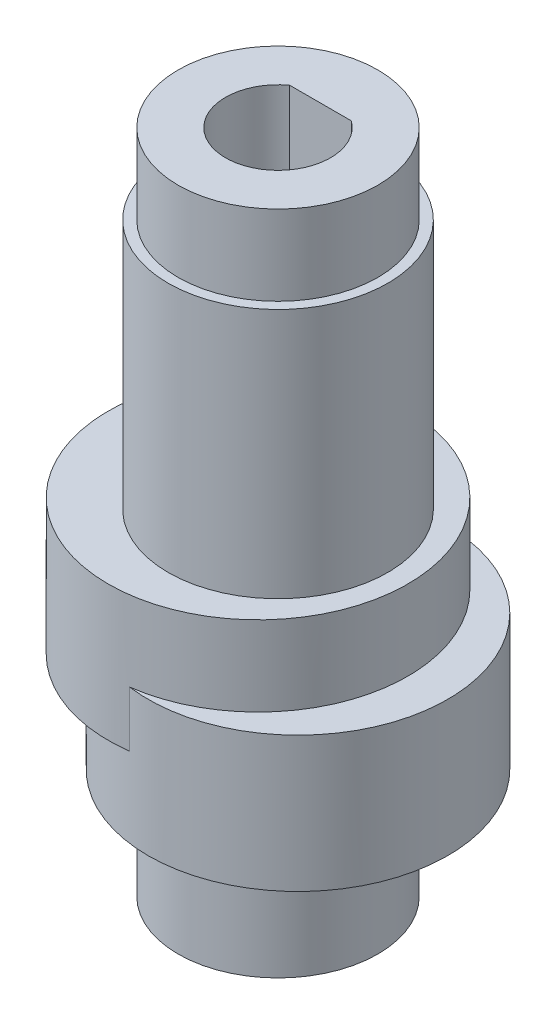
ISO-10303-21;
HEADER;
FILE_DESCRIPTION(('STEP AP214'),'2;1');
FILE_NAME('part.step','',(''),(''),'','','');
FILE_SCHEMA(('AUTOMOTIVE_DESIGN { 1 0 10303 214 1 1 1 1 }'));
ENDSEC;
DATA;
#1=APPLICATION_CONTEXT('core data for automotive mechanical design processes');
#2=APPLICATION_PROTOCOL_DEFINITION('international standard','automotive_design',2000,#1);
#3=PRODUCT_CONTEXT('',#1,'mechanical');
#4=PRODUCT('Part','Part','',(#3));
#5=PRODUCT_RELATED_PRODUCT_CATEGORY('part','',(#4));
#6=PRODUCT_DEFINITION_FORMATION('','',#4);
#7=PRODUCT_DEFINITION_CONTEXT('part definition',#1,'design');
#8=PRODUCT_DEFINITION('design','',#6,#7);
#9=PRODUCT_DEFINITION_SHAPE('','',#8);
#10=(LENGTH_UNIT() NAMED_UNIT(*) SI_UNIT(.MILLI.,.METRE.));
#11=(NAMED_UNIT(*) PLANE_ANGLE_UNIT() SI_UNIT($,.RADIAN.));
#12=(NAMED_UNIT(*) SI_UNIT($,.STERADIAN.) SOLID_ANGLE_UNIT());
#13=UNCERTAINTY_MEASURE_WITH_UNIT(LENGTH_MEASURE(1.E-05),#10,'distance_accuracy_value','');
#14=(GEOMETRIC_REPRESENTATION_CONTEXT(3) GLOBAL_UNCERTAINTY_ASSIGNED_CONTEXT((#13)) GLOBAL_UNIT_ASSIGNED_CONTEXT((#10,
#11,#12)) REPRESENTATION_CONTEXT('',''));
#15=CARTESIAN_POINT('',(0.,0.,0.));
#16=DIRECTION('',(0.,0.,1.));
#17=DIRECTION('',(1.,0.,0.));
#18=AXIS2_PLACEMENT_3D('',#15,#16,#17);
#19=CARTESIAN_POINT('',(0.,-4.,0.));
#20=DIRECTION('',(0.,1.,0.));
#21=DIRECTION('',(0.,0.,1.));
#22=AXIS2_PLACEMENT_3D('',#19,#20,#21);
#23=PLANE('',#22);
#24=CARTESIAN_POINT('',(1.,-4.,0.));
#25=DIRECTION('',(0.,1.,0.));
#26=DIRECTION('',(0.,0.,1.));
#27=AXIS2_PLACEMENT_3D('',#24,#25,#26);
#28=CIRCLE('',#27,7.5);
#29=CARTESIAN_POINT('',(1.,-4.,7.5));
#30=VERTEX_POINT('',#29);
#31=EDGE_CURVE('E126',#30,#30,#28,.T.);
#32=ORIENTED_EDGE('',*,*,#31,.F.);
#33=EDGE_LOOP('',(#32));
#34=FACE_BOUND('',#33,.T.);
#35=CARTESIAN_POINT('',(0.,-4.,0.));
#36=DIRECTION('',(0.,1.,0.));
#37=DIRECTION('',(0.,0.,1.));
#38=AXIS2_PLACEMENT_3D('',#35,#36,#37);
#39=CIRCLE('',#38,5.5);
#40=CARTESIAN_POINT('',(0.,-4.,5.5));
#41=VERTEX_POINT('',#40);
#42=EDGE_CURVE('E11',#41,#41,#39,.F.);
#43=ORIENTED_EDGE('',*,*,#42,.F.);
#44=EDGE_LOOP('',(#43));
#45=FACE_BOUND('',#44,.T.);
#46=ADVANCED_FACE('F41',(#34,#45),#23,.F.);
#47=CARTESIAN_POINT('',(-1.,6.77916666666667,0.));
#48=DIRECTION('',(0.,-1.,0.));
#49=DIRECTION('',(0.,0.,-1.));
#50=AXIS2_PLACEMENT_3D('',#47,#48,#49);
#51=CYLINDRICAL_SURFACE('',#50,7.5);
#52=CARTESIAN_POINT('',(-1.,6.77916666666667,0.));
#53=DIRECTION('',(0.,1.,0.));
#54=DIRECTION('',(0.,0.,1.));
#55=AXIS2_PLACEMENT_3D('',#52,#53,#54);
#56=CIRCLE('',#55,7.5);
#57=CARTESIAN_POINT('',(-1.,6.77916666666667,7.5));
#58=VERTEX_POINT('',#57);
#59=EDGE_CURVE('E93',#58,#58,#56,.T.);
#60=ORIENTED_EDGE('',*,*,#59,.F.);
#61=EDGE_LOOP('',(#60));
#62=FACE_BOUND('',#61,.T.);
#63=DIRECTION('',(0.,-1.,0.));
#64=VECTOR('',#63,1.);
#65=CARTESIAN_POINT('',(0.,2.77916666666667,7.43303437365925));
#66=LINE('',#65,#64);
#67=CARTESIAN_POINT('',(0.,2.77916666666667,7.43303437365925));
#68=VERTEX_POINT('',#67);
#69=CARTESIAN_POINT('',(0.,0.,7.43303437365925));
#70=VERTEX_POINT('',#69);
#71=EDGE_CURVE('E61',#68,#70,#66,.T.);
#72=ORIENTED_EDGE('',*,*,#71,.F.);
#73=CARTESIAN_POINT('',(-1.,2.77916666666667,0.));
#74=DIRECTION('',(0.,1.,0.));
#75=DIRECTION('',(0.,0.,1.));
#76=AXIS2_PLACEMENT_3D('',#73,#74,#75);
#77=CIRCLE('',#76,7.5);
#78=CARTESIAN_POINT('',(0.,2.77916666666667,-7.43303437365925));
#79=VERTEX_POINT('',#78);
#80=EDGE_CURVE('E56',#68,#79,#77,.T.);
#81=ORIENTED_EDGE('',*,*,#80,.T.);
#82=DIRECTION('',(0.,-1.,0.));
#83=VECTOR('',#82,1.);
#84=CARTESIAN_POINT('',(0.,2.77916666666667,-7.43303437365925));
#85=LINE('',#84,#83);
#86=CARTESIAN_POINT('',(0.,0.,-7.43303437365925));
#87=VERTEX_POINT('',#86);
#88=EDGE_CURVE('E133',#79,#87,#85,.T.);
#89=ORIENTED_EDGE('',*,*,#88,.T.);
#90=CARTESIAN_POINT('',(-1.,0.,0.));
#91=DIRECTION('',(0.,1.,0.));
#92=DIRECTION('',(0.,0.,1.));
#93=AXIS2_PLACEMENT_3D('',#90,#91,#92);
#94=CIRCLE('',#93,7.5);
#95=EDGE_CURVE('E136',#87,#70,#94,.T.);
#96=ORIENTED_EDGE('',*,*,#95,.T.);
#97=EDGE_LOOP('',(#72,#81,#89,#96));
#98=FACE_BOUND('',#97,.T.);
#99=ADVANCED_FACE('F43',(#62,#98),#51,.T.);
#100=CARTESIAN_POINT('',(0.,6.77916666666667,0.));
#101=DIRECTION('',(0.,-1.,0.));
#102=DIRECTION('',(0.,0.,-1.));
#103=AXIS2_PLACEMENT_3D('',#100,#101,#102);
#104=CYLINDRICAL_SURFACE('',#103,2.627);
#105=DIRECTION('',(0.,-1.,0.));
#106=VECTOR('',#105,1.);
#107=CARTESIAN_POINT('',(1.54175224987674,6.77916666666667,-2.127));
#108=LINE('',#107,#106);
#109=CARTESIAN_POINT('',(1.54175224987674,23.3208333333333,-2.127));
#110=VERTEX_POINT('',#109);
#111=CARTESIAN_POINT('',(1.54175224987674,-10.0166666666667,-2.127));
#112=VERTEX_POINT('',#111);
#113=EDGE_CURVE('E83',#110,#112,#108,.T.);
#114=ORIENTED_EDGE('',*,*,#113,.T.);
#115=CARTESIAN_POINT('',(0.,-10.0166666666667,0.));
#116=DIRECTION('',(0.,-1.,0.));
#117=DIRECTION('',(0.,0.,-1.));
#118=AXIS2_PLACEMENT_3D('',#115,#116,#117);
#119=CIRCLE('',#118,2.627);
#120=CARTESIAN_POINT('',(-1.54175224987674,-10.0166666666667,-2.127));
#121=VERTEX_POINT('',#120);
#122=EDGE_CURVE('E120',#121,#112,#119,.F.);
#123=ORIENTED_EDGE('',*,*,#122,.F.);
#124=DIRECTION('',(0.,-1.,0.));
#125=VECTOR('',#124,1.);
#126=CARTESIAN_POINT('',(-1.54175224987674,6.77916666666667,-2.127));
#127=LINE('',#126,#125);
#128=CARTESIAN_POINT('',(-1.54175224987674,23.3208333333333,-2.127));
#129=VERTEX_POINT('',#128);
#130=EDGE_CURVE('E49',#129,#121,#127,.T.);
#131=ORIENTED_EDGE('',*,*,#130,.F.);
#132=CARTESIAN_POINT('',(0.,23.3208333333333,0.));
#133=DIRECTION('',(0.,1.,0.));
#134=DIRECTION('',(0.,0.,1.));
#135=AXIS2_PLACEMENT_3D('',#132,#133,#134);
#136=CIRCLE('',#135,2.627);
#137=EDGE_CURVE('E96',#110,#129,#136,.F.);
#138=ORIENTED_EDGE('',*,*,#137,.F.);
#139=EDGE_LOOP('',(#114,#123,#131,#138));
#140=FACE_BOUND('',#139,.T.);
#141=ADVANCED_FACE('F97',(#140),#104,.F.);
#142=CARTESIAN_POINT('',(0.,6.77916666666667,-2.127));
#143=DIRECTION('',(0.,0.,-1.));
#144=DIRECTION('',(-1.,0.,0.));
#145=AXIS2_PLACEMENT_3D('',#142,#143,#144);
#146=PLANE('',#145);
#147=ORIENTED_EDGE('',*,*,#130,.T.);
#148=DIRECTION('',(-1.,0.,0.));
#149=VECTOR('',#148,1.);
#150=CARTESIAN_POINT('',(0.,-10.0166666666667,-2.127));
#151=LINE('',#150,#149);
#152=EDGE_CURVE('E89',#112,#121,#151,.T.);
#153=ORIENTED_EDGE('',*,*,#152,.F.);
#154=ORIENTED_EDGE('',*,*,#113,.F.);
#155=DIRECTION('',(1.,0.,0.));
#156=VECTOR('',#155,1.);
#157=CARTESIAN_POINT('',(0.,23.3208333333333,-2.127));
#158=LINE('',#157,#156);
#159=EDGE_CURVE('E87',#129,#110,#158,.T.);
#160=ORIENTED_EDGE('',*,*,#159,.F.);
#161=EDGE_LOOP('',(#147,#153,#154,#160));
#162=FACE_BOUND('',#161,.T.);
#163=ADVANCED_FACE('F85',(#162),#146,.F.);
#164=CARTESIAN_POINT('',(0.,6.77916666666667,0.));
#165=DIRECTION('',(0.,1.,0.));
#166=DIRECTION('',(0.,0.,1.));
#167=AXIS2_PLACEMENT_3D('',#164,#165,#166);
#168=PLANE('',#167);
#169=CARTESIAN_POINT('',(0.,6.77916666666667,0.));
#170=DIRECTION('',(0.,1.,0.));
#171=DIRECTION('',(0.,0.,1.));
#172=AXIS2_PLACEMENT_3D('',#169,#170,#171);
#173=CIRCLE('',#172,5.5);
#174=CARTESIAN_POINT('',(0.,6.77916666666667,5.5));
#175=VERTEX_POINT('',#174);
#176=EDGE_CURVE('E109',#175,#175,#173,.T.);
#177=ORIENTED_EDGE('',*,*,#176,.F.);
#178=EDGE_LOOP('',(#177));
#179=FACE_BOUND('',#178,.T.);
#180=ORIENTED_EDGE('',*,*,#59,.T.);
#181=EDGE_LOOP('',(#180));
#182=FACE_BOUND('',#181,.T.);
#183=ADVANCED_FACE('F173',(#179,#182),#168,.T.);
#184=CARTESIAN_POINT('',(0.,0.,0.));
#185=DIRECTION('',(0.,1.,0.));
#186=DIRECTION('',(0.,0.,1.));
#187=AXIS2_PLACEMENT_3D('',#184,#185,#186);
#188=PLANE('',#187);
#189=ORIENTED_EDGE('',*,*,#95,.F.);
#190=CARTESIAN_POINT('',(1.,0.,0.));
#191=DIRECTION('',(0.,1.,0.));
#192=DIRECTION('',(0.,0.,1.));
#193=AXIS2_PLACEMENT_3D('',#190,#191,#192);
#194=CIRCLE('',#193,7.5);
#195=EDGE_CURVE('E125',#87,#70,#194,.T.);
#196=ORIENTED_EDGE('',*,*,#195,.T.);
#197=EDGE_LOOP('',(#189,#196));
#198=FACE_BOUND('',#197,.T.);
#199=ADVANCED_FACE('F171',(#198),#188,.F.);
#200=CARTESIAN_POINT('',(1.,2.77916666666667,0.));
#201=DIRECTION('',(0.,-1.,0.));
#202=DIRECTION('',(0.,0.,-1.));
#203=AXIS2_PLACEMENT_3D('',#200,#201,#202);
#204=CYLINDRICAL_SURFACE('',#203,7.5);
#205=ORIENTED_EDGE('',*,*,#71,.T.);
#206=ORIENTED_EDGE('',*,*,#195,.F.);
#207=ORIENTED_EDGE('',*,*,#88,.F.);
#208=CARTESIAN_POINT('',(1.,2.77916666666667,0.));
#209=DIRECTION('',(0.,1.,0.));
#210=DIRECTION('',(0.,0.,1.));
#211=AXIS2_PLACEMENT_3D('',#208,#209,#210);
#212=CIRCLE('',#211,7.5);
#213=EDGE_CURVE('E131',#68,#79,#212,.T.);
#214=ORIENTED_EDGE('',*,*,#213,.F.);
#215=EDGE_LOOP('',(#205,#206,#207,#214));
#216=FACE_BOUND('',#215,.T.);
#217=ORIENTED_EDGE('',*,*,#31,.T.);
#218=EDGE_LOOP('',(#217));
#219=FACE_BOUND('',#218,.T.);
#220=ADVANCED_FACE('F157',(#216,#219),#204,.T.);
#221=CARTESIAN_POINT('',(0.,2.77916666666667,0.));
#222=DIRECTION('',(0.,1.,0.));
#223=DIRECTION('',(0.,0.,1.));
#224=AXIS2_PLACEMENT_3D('',#221,#222,#223);
#225=PLANE('',#224);
#226=ORIENTED_EDGE('',*,*,#80,.F.);
#227=ORIENTED_EDGE('',*,*,#213,.T.);
#228=EDGE_LOOP('',(#226,#227));
#229=FACE_BOUND('',#228,.T.);
#230=ADVANCED_FACE('F149',(#229),#225,.T.);
#231=CARTESIAN_POINT('',(0.,-10.0166666666667,0.));
#232=DIRECTION('',(0.,1.,0.));
#233=DIRECTION('',(0.,0.,1.));
#234=AXIS2_PLACEMENT_3D('',#231,#232,#233);
#235=CYLINDRICAL_SURFACE('',#234,5.);
#236=CARTESIAN_POINT('',(0.,-5.25416666666667,0.));
#237=DIRECTION('',(0.,-1.,0.));
#238=DIRECTION('',(0.,0.,-1.));
#239=AXIS2_PLACEMENT_3D('',#236,#237,#238);
#240=CIRCLE('',#239,5.);
#241=CARTESIAN_POINT('',(0.,-5.25416666666667,-5.));
#242=VERTEX_POINT('',#241);
#243=EDGE_CURVE('E113',#242,#242,#240,.T.);
#244=ORIENTED_EDGE('',*,*,#243,.T.);
#245=EDGE_LOOP('',(#244));
#246=FACE_BOUND('',#245,.T.);
#247=CARTESIAN_POINT('',(0.,-10.0166666666667,0.));
#248=DIRECTION('',(0.,-1.,0.));
#249=DIRECTION('',(0.,0.,-1.));
#250=AXIS2_PLACEMENT_3D('',#247,#248,#249);
#251=CIRCLE('',#250,5.);
#252=CARTESIAN_POINT('',(0.,-10.0166666666667,-5.));
#253=VERTEX_POINT('',#252);
#254=EDGE_CURVE('E122',#253,#253,#251,.T.);
#255=ORIENTED_EDGE('',*,*,#254,.F.);
#256=EDGE_LOOP('',(#255));
#257=FACE_BOUND('',#256,.T.);
#258=ADVANCED_FACE('F144',(#246,#257),#235,.T.);
#259=CARTESIAN_POINT('',(0.,-10.0166666666667,0.));
#260=DIRECTION('',(0.,-1.,0.));
#261=DIRECTION('',(0.,0.,-1.));
#262=AXIS2_PLACEMENT_3D('',#259,#260,#261);
#263=PLANE('',#262);
#264=ORIENTED_EDGE('',*,*,#152,.T.);
#265=ORIENTED_EDGE('',*,*,#122,.T.);
#266=EDGE_LOOP('',(#264,#265));
#267=FACE_BOUND('',#266,.T.);
#268=ORIENTED_EDGE('',*,*,#254,.T.);
#269=EDGE_LOOP('',(#268));
#270=FACE_BOUND('',#269,.T.);
#271=ADVANCED_FACE('F140',(#267,#270),#263,.T.);
#272=CARTESIAN_POINT('',(0.,-5.25416666666667,0.));
#273=DIRECTION('',(0.,-1.,0.));
#274=DIRECTION('',(0.,0.,-1.));
#275=AXIS2_PLACEMENT_3D('',#272,#273,#274);
#276=PLANE('',#275);
#277=CARTESIAN_POINT('',(0.,-5.25416666666667,0.));
#278=DIRECTION('',(0.,-1.,0.));
#279=DIRECTION('',(0.,0.,-1.));
#280=AXIS2_PLACEMENT_3D('',#277,#278,#279);
#281=CIRCLE('',#280,5.5);
#282=CARTESIAN_POINT('',(0.,-5.25416666666667,-5.5));
#283=VERTEX_POINT('',#282);
#284=EDGE_CURVE('E116',#283,#283,#281,.T.);
#285=ORIENTED_EDGE('',*,*,#284,.T.);
#286=EDGE_LOOP('',(#285));
#287=FACE_BOUND('',#286,.T.);
#288=ORIENTED_EDGE('',*,*,#243,.F.);
#289=EDGE_LOOP('',(#288));
#290=FACE_BOUND('',#289,.T.);
#291=ADVANCED_FACE('F143',(#287,#290),#276,.T.);
#292=CARTESIAN_POINT('',(0.,-5.25416666666667,0.));
#293=DIRECTION('',(0.,1.,0.));
#294=DIRECTION('',(0.,0.,1.));
#295=AXIS2_PLACEMENT_3D('',#292,#293,#294);
#296=CYLINDRICAL_SURFACE('',#295,5.5);
#297=ORIENTED_EDGE('',*,*,#284,.F.);
#298=EDGE_LOOP('',(#297));
#299=FACE_BOUND('',#298,.T.);
#300=ORIENTED_EDGE('',*,*,#42,.T.);
#301=EDGE_LOOP('',(#300));
#302=FACE_BOUND('',#301,.T.);
#303=ADVANCED_FACE('F190',(#299,#302),#296,.T.);
#304=CARTESIAN_POINT('',(0.,23.3208333333333,0.));
#305=DIRECTION('',(0.,-1.,0.));
#306=DIRECTION('',(0.,0.,-1.));
#307=AXIS2_PLACEMENT_3D('',#304,#305,#306);
#308=CYLINDRICAL_SURFACE('',#307,5.);
#309=CARTESIAN_POINT('',(0.,19.3208333333333,0.));
#310=DIRECTION('',(0.,1.,0.));
#311=DIRECTION('',(0.,0.,1.));
#312=AXIS2_PLACEMENT_3D('',#309,#310,#311);
#313=CIRCLE('',#312,5.);
#314=CARTESIAN_POINT('',(0.,19.3208333333333,5.));
#315=VERTEX_POINT('',#314);
#316=EDGE_CURVE('E106',#315,#315,#313,.T.);
#317=ORIENTED_EDGE('',*,*,#316,.T.);
#318=EDGE_LOOP('',(#317));
#319=FACE_BOUND('',#318,.T.);
#320=CARTESIAN_POINT('',(0.,23.3208333333333,0.));
#321=DIRECTION('',(0.,1.,0.));
#322=DIRECTION('',(0.,0.,1.));
#323=AXIS2_PLACEMENT_3D('',#320,#321,#322);
#324=CIRCLE('',#323,5.);
#325=CARTESIAN_POINT('',(0.,23.3208333333333,5.));
#326=VERTEX_POINT('',#325);
#327=EDGE_CURVE('E99',#326,#326,#324,.T.);
#328=ORIENTED_EDGE('',*,*,#327,.F.);
#329=EDGE_LOOP('',(#328));
#330=FACE_BOUND('',#329,.T.);
#331=ADVANCED_FACE('F201',(#319,#330),#308,.T.);
#332=CARTESIAN_POINT('',(0.,23.3208333333333,0.));
#333=DIRECTION('',(0.,1.,0.));
#334=DIRECTION('',(0.,0.,1.));
#335=AXIS2_PLACEMENT_3D('',#332,#333,#334);
#336=PLANE('',#335);
#337=ORIENTED_EDGE('',*,*,#159,.T.);
#338=ORIENTED_EDGE('',*,*,#137,.T.);
#339=EDGE_LOOP('',(#337,#338));
#340=FACE_BOUND('',#339,.T.);
#341=ORIENTED_EDGE('',*,*,#327,.T.);
#342=EDGE_LOOP('',(#341));
#343=FACE_BOUND('',#342,.T.);
#344=ADVANCED_FACE('F101',(#340,#343),#336,.T.);
#345=CARTESIAN_POINT('',(0.,19.3208333333333,0.));
#346=DIRECTION('',(0.,-1.,0.));
#347=DIRECTION('',(0.,0.,-1.));
#348=AXIS2_PLACEMENT_3D('',#345,#346,#347);
#349=CYLINDRICAL_SURFACE('',#348,5.5);
#350=CARTESIAN_POINT('',(0.,19.3208333333333,0.));
#351=DIRECTION('',(0.,1.,0.));
#352=DIRECTION('',(0.,0.,1.));
#353=AXIS2_PLACEMENT_3D('',#350,#351,#352);
#354=CIRCLE('',#353,5.5);
#355=CARTESIAN_POINT('',(0.,19.3208333333333,5.5));
#356=VERTEX_POINT('',#355);
#357=EDGE_CURVE('E103',#356,#356,#354,.T.);
#358=ORIENTED_EDGE('',*,*,#357,.F.);
#359=EDGE_LOOP('',(#358));
#360=FACE_BOUND('',#359,.T.);
#361=ORIENTED_EDGE('',*,*,#176,.T.);
#362=EDGE_LOOP('',(#361));
#363=FACE_BOUND('',#362,.T.);
#364=ADVANCED_FACE('F200',(#360,#363),#349,.T.);
#365=CARTESIAN_POINT('',(0.,19.3208333333333,0.));
#366=DIRECTION('',(0.,1.,0.));
#367=DIRECTION('',(0.,0.,1.));
#368=AXIS2_PLACEMENT_3D('',#365,#366,#367);
#369=PLANE('',#368);
#370=ORIENTED_EDGE('',*,*,#316,.F.);
#371=EDGE_LOOP('',(#370));
#372=FACE_BOUND('',#371,.T.);
#373=ORIENTED_EDGE('',*,*,#357,.T.);
#374=EDGE_LOOP('',(#373));
#375=FACE_BOUND('',#374,.T.);
#376=ADVANCED_FACE('F223',(#372,#375),#369,.T.);
#377=CLOSED_SHELL('',(#46,#99,#141,#163,#183,#199,#220,#230,#258,#271,#291,#303,#331,#344,#364,#376));
#378=MANIFOLD_SOLID_BREP('B2',#377);
#379=ADVANCED_BREP_SHAPE_REPRESENTATION('',(#18,#378),#14);
#380=SHAPE_DEFINITION_REPRESENTATION(#9,#379);
ENDSEC;
END-ISO-10303-21;
